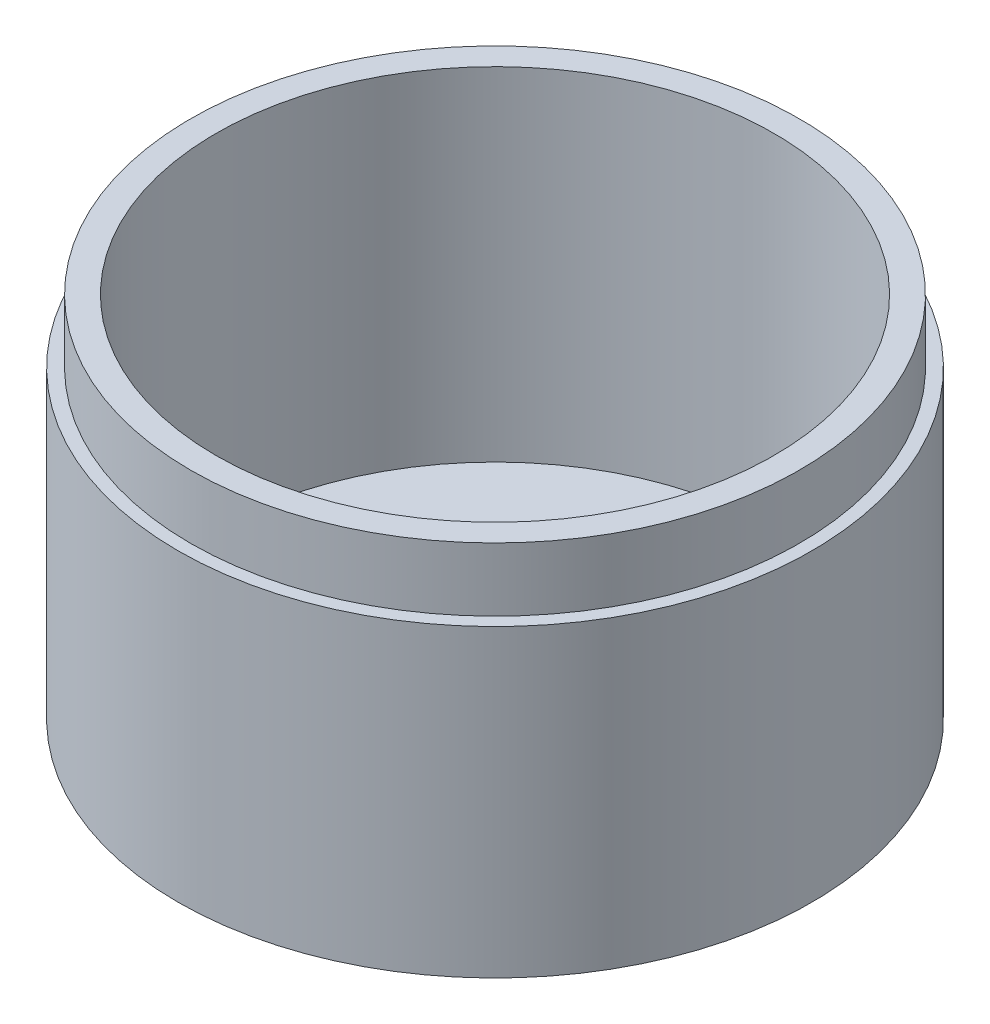
ISO-10303-21;
HEADER;
FILE_DESCRIPTION(('STEP AP214'),'2;1');
FILE_NAME('part.step','',(''),(''),'','','');
FILE_SCHEMA(('AUTOMOTIVE_DESIGN { 1 0 10303 214 1 1 1 1 }'));
ENDSEC;
DATA;
#1=APPLICATION_CONTEXT('core data for automotive mechanical design processes');
#2=APPLICATION_PROTOCOL_DEFINITION('international standard','automotive_design',2000,#1);
#3=PRODUCT_CONTEXT('',#1,'mechanical');
#4=PRODUCT('Part','Part','',(#3));
#5=PRODUCT_RELATED_PRODUCT_CATEGORY('part','',(#4));
#6=PRODUCT_DEFINITION_FORMATION('','',#4);
#7=PRODUCT_DEFINITION_CONTEXT('part definition',#1,'design');
#8=PRODUCT_DEFINITION('design','',#6,#7);
#9=PRODUCT_DEFINITION_SHAPE('','',#8);
#10=(LENGTH_UNIT() NAMED_UNIT(*) SI_UNIT(.MILLI.,.METRE.));
#11=(NAMED_UNIT(*) PLANE_ANGLE_UNIT() SI_UNIT($,.RADIAN.));
#12=(NAMED_UNIT(*) SI_UNIT($,.STERADIAN.) SOLID_ANGLE_UNIT());
#13=UNCERTAINTY_MEASURE_WITH_UNIT(LENGTH_MEASURE(1.E-05),#10,'distance_accuracy_value','');
#14=(GEOMETRIC_REPRESENTATION_CONTEXT(3) GLOBAL_UNCERTAINTY_ASSIGNED_CONTEXT((#13)) GLOBAL_UNIT_ASSIGNED_CONTEXT((#10,
#11,#12)) REPRESENTATION_CONTEXT('',''));
#15=CARTESIAN_POINT('',(0.,0.,0.));
#16=DIRECTION('',(0.,0.,1.));
#17=DIRECTION('',(1.,0.,0.));
#18=AXIS2_PLACEMENT_3D('',#15,#16,#17);
#19=CARTESIAN_POINT('',(0.,29.,0.));
#20=DIRECTION('',(0.,-1.,0.));
#21=DIRECTION('',(0.,0.,-1.));
#22=AXIS2_PLACEMENT_3D('',#19,#20,#21);
#23=CYLINDRICAL_SURFACE('',#22,25.);
#24=CARTESIAN_POINT('',(0.,0.,0.));
#25=DIRECTION('',(0.,1.,0.));
#26=DIRECTION('',(0.,0.,1.));
#27=AXIS2_PLACEMENT_3D('',#24,#25,#26);
#28=CIRCLE('',#27,25.);
#29=CARTESIAN_POINT('',(0.,0.,25.));
#30=VERTEX_POINT('',#29);
#31=EDGE_CURVE('E11',#30,#30,#28,.T.);
#32=ORIENTED_EDGE('',*,*,#31,.T.);
#33=EDGE_LOOP('',(#32));
#34=FACE_BOUND('',#33,.T.);
#35=CARTESIAN_POINT('',(0.,24.,0.));
#36=DIRECTION('',(0.,1.,0.));
#37=DIRECTION('',(0.,0.,1.));
#38=AXIS2_PLACEMENT_3D('',#35,#36,#37);
#39=CIRCLE('',#38,25.);
#40=CARTESIAN_POINT('',(0.,24.,25.));
#41=VERTEX_POINT('',#40);
#42=EDGE_CURVE('E39',#41,#41,#39,.T.);
#43=ORIENTED_EDGE('',*,*,#42,.F.);
#44=EDGE_LOOP('',(#43));
#45=FACE_BOUND('',#44,.T.);
#46=ADVANCED_FACE('F33',(#34,#45),#23,.T.);
#47=CARTESIAN_POINT('',(0.,0.,0.));
#48=DIRECTION('',(0.,1.,0.));
#49=DIRECTION('',(0.,0.,1.));
#50=AXIS2_PLACEMENT_3D('',#47,#48,#49);
#51=PLANE('',#50);
#52=ORIENTED_EDGE('',*,*,#31,.F.);
#53=EDGE_LOOP('',(#52));
#54=FACE_BOUND('',#53,.T.);
#55=ADVANCED_FACE('F75',(#54),#51,.F.);
#56=CARTESIAN_POINT('',(0.,24.,0.));
#57=DIRECTION('',(0.,1.,0.));
#58=DIRECTION('',(0.,0.,1.));
#59=AXIS2_PLACEMENT_3D('',#56,#57,#58);
#60=PLANE('',#59);
#61=CARTESIAN_POINT('',(0.,24.,0.));
#62=DIRECTION('',(0.,1.,0.));
#63=DIRECTION('',(0.,0.,1.));
#64=AXIS2_PLACEMENT_3D('',#61,#62,#63);
#65=CIRCLE('',#64,24.);
#66=CARTESIAN_POINT('',(0.,24.,24.));
#67=VERTEX_POINT('',#66);
#68=EDGE_CURVE('E43',#67,#67,#65,.T.);
#69=ORIENTED_EDGE('',*,*,#68,.F.);
#70=EDGE_LOOP('',(#69));
#71=FACE_BOUND('',#70,.T.);
#72=ORIENTED_EDGE('',*,*,#42,.T.);
#73=EDGE_LOOP('',(#72));
#74=FACE_BOUND('',#73,.T.);
#75=ADVANCED_FACE('F69',(#71,#74),#60,.T.);
#76=CARTESIAN_POINT('',(0.,24.,0.));
#77=DIRECTION('',(0.,1.,0.));
#78=DIRECTION('',(0.,0.,1.));
#79=AXIS2_PLACEMENT_3D('',#76,#77,#78);
#80=CYLINDRICAL_SURFACE('',#79,24.);
#81=ORIENTED_EDGE('',*,*,#68,.T.);
#82=EDGE_LOOP('',(#81));
#83=FACE_BOUND('',#82,.T.);
#84=CARTESIAN_POINT('',(0.,29.,0.));
#85=DIRECTION('',(0.,1.,0.));
#86=DIRECTION('',(0.,0.,1.));
#87=AXIS2_PLACEMENT_3D('',#84,#85,#86);
#88=CIRCLE('',#87,24.);
#89=CARTESIAN_POINT('',(0.,29.,24.));
#90=VERTEX_POINT('',#89);
#91=EDGE_CURVE('E47',#90,#90,#88,.T.);
#92=ORIENTED_EDGE('',*,*,#91,.F.);
#93=EDGE_LOOP('',(#92));
#94=FACE_BOUND('',#93,.T.);
#95=ADVANCED_FACE('F64',(#83,#94),#80,.T.);
#96=CARTESIAN_POINT('',(0.,29.,0.));
#97=DIRECTION('',(0.,1.,0.));
#98=DIRECTION('',(0.,0.,1.));
#99=AXIS2_PLACEMENT_3D('',#96,#97,#98);
#100=PLANE('',#99);
#101=CARTESIAN_POINT('',(0.,29.,0.));
#102=DIRECTION('',(0.,1.,0.));
#103=DIRECTION('',(0.,0.,1.));
#104=AXIS2_PLACEMENT_3D('',#101,#102,#103);
#105=CIRCLE('',#104,22.);
#106=CARTESIAN_POINT('',(0.,29.,22.));
#107=VERTEX_POINT('',#106);
#108=EDGE_CURVE('E55',#107,#107,#105,.T.);
#109=ORIENTED_EDGE('',*,*,#108,.F.);
#110=EDGE_LOOP('',(#109));
#111=FACE_BOUND('',#110,.T.);
#112=ORIENTED_EDGE('',*,*,#91,.T.);
#113=EDGE_LOOP('',(#112));
#114=FACE_BOUND('',#113,.T.);
#115=ADVANCED_FACE('F61',(#111,#114),#100,.T.);
#116=CARTESIAN_POINT('',(0.,-62.2253967444162,0.));
#117=DIRECTION('',(0.,1.,0.));
#118=DIRECTION('',(0.,0.,1.));
#119=AXIS2_PLACEMENT_3D('',#116,#117,#118);
#120=CYLINDRICAL_SURFACE('',#119,22.);
#121=CARTESIAN_POINT('',(0.,2.,0.));
#122=DIRECTION('',(0.,1.,0.));
#123=DIRECTION('',(0.,0.,1.));
#124=AXIS2_PLACEMENT_3D('',#121,#122,#123);
#125=CIRCLE('',#124,22.);
#126=CARTESIAN_POINT('',(0.,2.,22.));
#127=VERTEX_POINT('',#126);
#128=EDGE_CURVE('E51',#127,#127,#125,.F.);
#129=ORIENTED_EDGE('',*,*,#128,.T.);
#130=EDGE_LOOP('',(#129));
#131=FACE_BOUND('',#130,.T.);
#132=ORIENTED_EDGE('',*,*,#108,.T.);
#133=EDGE_LOOP('',(#132));
#134=FACE_BOUND('',#133,.T.);
#135=ADVANCED_FACE('F59',(#131,#134),#120,.F.);
#136=CARTESIAN_POINT('',(0.,2.,0.));
#137=DIRECTION('',(0.,1.,0.));
#138=DIRECTION('',(0.,0.,1.));
#139=AXIS2_PLACEMENT_3D('',#136,#137,#138);
#140=PLANE('',#139);
#141=ORIENTED_EDGE('',*,*,#128,.F.);
#142=EDGE_LOOP('',(#141));
#143=FACE_BOUND('',#142,.T.);
#144=ADVANCED_FACE('F112',(#143),#140,.T.);
#145=CLOSED_SHELL('',(#46,#55,#75,#95,#115,#135,#144));
#146=MANIFOLD_SOLID_BREP('B2',#145);
#147=ADVANCED_BREP_SHAPE_REPRESENTATION('',(#18,#146),#14);
#148=SHAPE_DEFINITION_REPRESENTATION(#9,#147);
ENDSEC;
END-ISO-10303-21;
